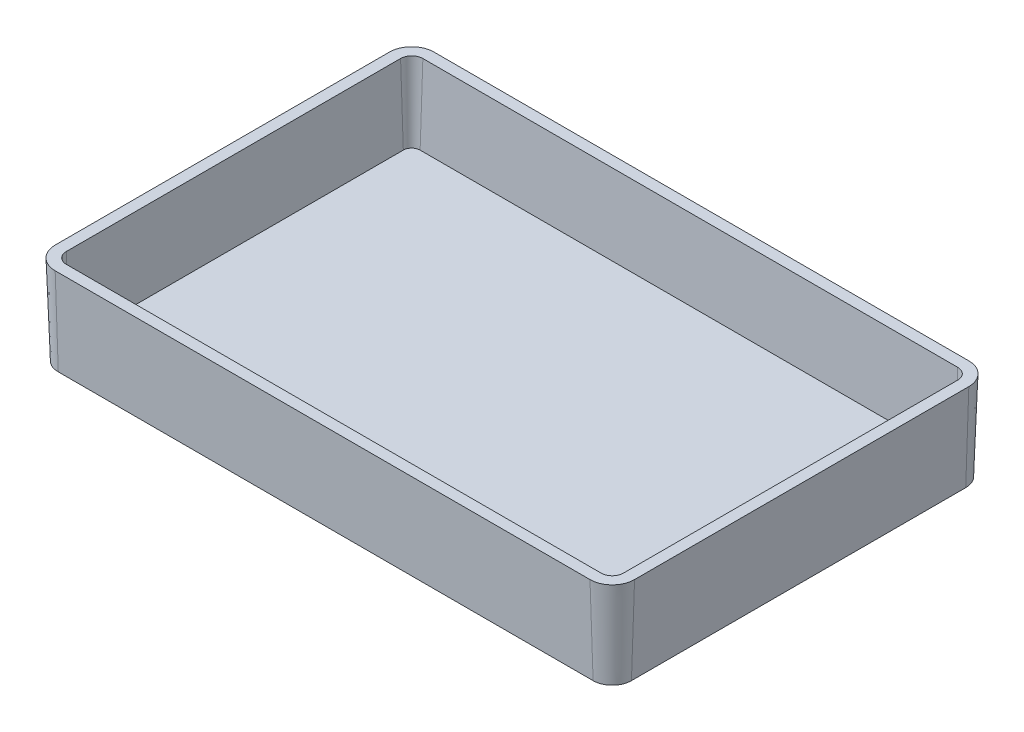
ISO-10303-21;
HEADER;
FILE_DESCRIPTION(('STEP AP214'),'2;1');
FILE_NAME('part.step','',(''),(''),'','','');
FILE_SCHEMA(('AUTOMOTIVE_DESIGN { 1 0 10303 214 1 1 1 1 }'));
ENDSEC;
DATA;
#1=APPLICATION_CONTEXT('core data for automotive mechanical design processes');
#2=APPLICATION_PROTOCOL_DEFINITION('international standard','automotive_design',2000,#1);
#3=PRODUCT_CONTEXT('',#1,'mechanical');
#4=PRODUCT('Part','Part','',(#3));
#5=PRODUCT_RELATED_PRODUCT_CATEGORY('part','',(#4));
#6=PRODUCT_DEFINITION_FORMATION('','',#4);
#7=PRODUCT_DEFINITION_CONTEXT('part definition',#1,'design');
#8=PRODUCT_DEFINITION('design','',#6,#7);
#9=PRODUCT_DEFINITION_SHAPE('','',#8);
#10=(LENGTH_UNIT() NAMED_UNIT(*) SI_UNIT(.MILLI.,.METRE.));
#11=(NAMED_UNIT(*) PLANE_ANGLE_UNIT() SI_UNIT($,.RADIAN.));
#12=(NAMED_UNIT(*) SI_UNIT($,.STERADIAN.) SOLID_ANGLE_UNIT());
#13=UNCERTAINTY_MEASURE_WITH_UNIT(LENGTH_MEASURE(1.E-05),#10,'distance_accuracy_value','');
#14=(GEOMETRIC_REPRESENTATION_CONTEXT(3) GLOBAL_UNCERTAINTY_ASSIGNED_CONTEXT((#13)) GLOBAL_UNIT_ASSIGNED_CONTEXT((#10,
#11,#12)) REPRESENTATION_CONTEXT('',''));
#15=CARTESIAN_POINT('',(0.,0.,0.));
#16=DIRECTION('',(0.,0.,1.));
#17=DIRECTION('',(1.,0.,0.));
#18=AXIS2_PLACEMENT_3D('',#15,#16,#17);
#19=CARTESIAN_POINT('',(-12.,0.,-7.5));
#20=DIRECTION('',(0.,-1.,0.));
#21=DIRECTION('',(0.,0.,-1.));
#22=AXIS2_PLACEMENT_3D('',#19,#20,#21);
#23=PLANE('',#22);
#24=CARTESIAN_POINT('',(-12.,0.,-7.5));
#25=DIRECTION('',(0.,1.,0.));
#26=DIRECTION('',(0.,0.,-1.));
#27=AXIS2_PLACEMENT_3D('',#24,#25,#26);
#28=CIRCLE('',#27,1.);
#29=CARTESIAN_POINT('',(-12.,0.,-8.5));
#30=VERTEX_POINT('',#29);
#31=CARTESIAN_POINT('',(-13.,0.,-7.5));
#32=VERTEX_POINT('',#31);
#33=EDGE_CURVE('E175',#30,#32,#28,.T.);
#34=ORIENTED_EDGE('',*,*,#33,.T.);
#35=DIRECTION('',(0.,0.,1.));
#36=VECTOR('',#35,1.);
#37=CARTESIAN_POINT('',(-13.,0.,7.5));
#38=LINE('',#37,#36);
#39=CARTESIAN_POINT('',(-13.,0.,7.5));
#40=VERTEX_POINT('',#39);
#41=EDGE_CURVE('E240',#32,#40,#38,.T.);
#42=ORIENTED_EDGE('',*,*,#41,.T.);
#43=CARTESIAN_POINT('',(-12.,0.,7.5));
#44=DIRECTION('',(0.,1.,0.));
#45=DIRECTION('',(0.,0.,-1.));
#46=AXIS2_PLACEMENT_3D('',#43,#44,#45);
#47=CIRCLE('',#46,1.);
#48=CARTESIAN_POINT('',(-12.,0.,8.5));
#49=VERTEX_POINT('',#48);
#50=EDGE_CURVE('E243',#40,#49,#47,.T.);
#51=ORIENTED_EDGE('',*,*,#50,.T.);
#52=DIRECTION('',(1.,0.,0.));
#53=VECTOR('',#52,1.);
#54=CARTESIAN_POINT('',(-12.,0.,8.5));
#55=LINE('',#54,#53);
#56=CARTESIAN_POINT('',(12.,0.,8.5));
#57=VERTEX_POINT('',#56);
#58=EDGE_CURVE('E246',#49,#57,#55,.T.);
#59=ORIENTED_EDGE('',*,*,#58,.T.);
#60=CARTESIAN_POINT('',(12.,0.,7.5));
#61=DIRECTION('',(0.,1.,0.));
#62=DIRECTION('',(0.,0.,-1.));
#63=AXIS2_PLACEMENT_3D('',#60,#61,#62);
#64=CIRCLE('',#63,1.);
#65=CARTESIAN_POINT('',(13.,0.,7.5));
#66=VERTEX_POINT('',#65);
#67=EDGE_CURVE('E249',#57,#66,#64,.T.);
#68=ORIENTED_EDGE('',*,*,#67,.T.);
#69=DIRECTION('',(0.,0.,-1.));
#70=VECTOR('',#69,1.);
#71=CARTESIAN_POINT('',(13.,0.,7.5));
#72=LINE('',#71,#70);
#73=CARTESIAN_POINT('',(13.,0.,-7.5));
#74=VERTEX_POINT('',#73);
#75=EDGE_CURVE('E252',#66,#74,#72,.T.);
#76=ORIENTED_EDGE('',*,*,#75,.T.);
#77=CARTESIAN_POINT('',(12.,0.,-7.5));
#78=DIRECTION('',(0.,1.,0.));
#79=DIRECTION('',(0.,0.,1.));
#80=AXIS2_PLACEMENT_3D('',#77,#78,#79);
#81=CIRCLE('',#80,1.);
#82=CARTESIAN_POINT('',(12.,0.,-8.5));
#83=VERTEX_POINT('',#82);
#84=EDGE_CURVE('E255',#74,#83,#81,.T.);
#85=ORIENTED_EDGE('',*,*,#84,.T.);
#86=DIRECTION('',(-1.,0.,0.));
#87=VECTOR('',#86,1.);
#88=CARTESIAN_POINT('',(-12.,0.,-8.5));
#89=LINE('',#88,#87);
#90=EDGE_CURVE('E257',#83,#30,#89,.T.);
#91=ORIENTED_EDGE('',*,*,#90,.T.);
#92=EDGE_LOOP('',(#34,#42,#51,#59,#68,#76,#85,#91));
#93=FACE_BOUND('',#92,.T.);
#94=CARTESIAN_POINT('',(-12.,0.,-7.5));
#95=DIRECTION('',(0.,-1.,0.));
#96=DIRECTION('',(0.,0.,-1.));
#97=AXIS2_PLACEMENT_3D('',#94,#95,#96);
#98=CIRCLE('',#97,0.49969522785059);
#99=CARTESIAN_POINT('',(-12.,0.,-7.99969522785059));
#100=VERTEX_POINT('',#99);
#101=CARTESIAN_POINT('',(-12.4996952278506,0.,-7.5));
#102=VERTEX_POINT('',#101);
#103=EDGE_CURVE('E219',#100,#102,#98,.F.);
#104=ORIENTED_EDGE('',*,*,#103,.F.);
#105=DIRECTION('',(-1.,0.,0.));
#106=VECTOR('',#105,1.);
#107=CARTESIAN_POINT('',(-12.,0.,-7.99969522785059));
#108=LINE('',#107,#106);
#109=CARTESIAN_POINT('',(12.,0.,-7.99969522785059));
#110=VERTEX_POINT('',#109);
#111=EDGE_CURVE('E171',#110,#100,#108,.T.);
#112=ORIENTED_EDGE('',*,*,#111,.F.);
#113=CARTESIAN_POINT('',(12.,0.,-7.5));
#114=DIRECTION('',(0.,-1.,0.));
#115=DIRECTION('',(0.,0.,-1.));
#116=AXIS2_PLACEMENT_3D('',#113,#114,#115);
#117=CIRCLE('',#116,0.49969522785059);
#118=CARTESIAN_POINT('',(12.4996952278506,0.,-7.5));
#119=VERTEX_POINT('',#118);
#120=EDGE_CURVE('E56',#119,#110,#117,.F.);
#121=ORIENTED_EDGE('',*,*,#120,.F.);
#122=DIRECTION('',(0.,0.,-1.));
#123=VECTOR('',#122,1.);
#124=CARTESIAN_POINT('',(12.4996952278506,0.,7.5));
#125=LINE('',#124,#123);
#126=CARTESIAN_POINT('',(12.4996952278506,0.,7.5));
#127=VERTEX_POINT('',#126);
#128=EDGE_CURVE('E233',#127,#119,#125,.T.);
#129=ORIENTED_EDGE('',*,*,#128,.F.);
#130=CARTESIAN_POINT('',(12.,0.,7.5));
#131=DIRECTION('',(0.,-1.,0.));
#132=DIRECTION('',(0.,0.,-1.));
#133=AXIS2_PLACEMENT_3D('',#130,#131,#132);
#134=CIRCLE('',#133,0.49969522785059);
#135=CARTESIAN_POINT('',(12.,0.,7.99969522785059));
#136=VERTEX_POINT('',#135);
#137=EDGE_CURVE('E230',#136,#127,#134,.F.);
#138=ORIENTED_EDGE('',*,*,#137,.F.);
#139=DIRECTION('',(1.,0.,0.));
#140=VECTOR('',#139,1.);
#141=CARTESIAN_POINT('',(-12.,0.,7.99969522785059));
#142=LINE('',#141,#140);
#143=CARTESIAN_POINT('',(-12.,0.,7.99969522785059));
#144=VERTEX_POINT('',#143);
#145=EDGE_CURVE('E227',#144,#136,#142,.T.);
#146=ORIENTED_EDGE('',*,*,#145,.F.);
#147=CARTESIAN_POINT('',(-12.,0.,7.5));
#148=DIRECTION('',(0.,-1.,0.));
#149=DIRECTION('',(0.,0.,-1.));
#150=AXIS2_PLACEMENT_3D('',#147,#148,#149);
#151=CIRCLE('',#150,0.49969522785059);
#152=CARTESIAN_POINT('',(-12.4996952278506,0.,7.5));
#153=VERTEX_POINT('',#152);
#154=EDGE_CURVE('E224',#153,#144,#151,.F.);
#155=ORIENTED_EDGE('',*,*,#154,.F.);
#156=DIRECTION('',(0.,0.,1.));
#157=VECTOR('',#156,1.);
#158=CARTESIAN_POINT('',(-12.4996952278506,0.,7.5));
#159=LINE('',#158,#157);
#160=EDGE_CURVE('E221',#102,#153,#159,.T.);
#161=ORIENTED_EDGE('',*,*,#160,.F.);
#162=EDGE_LOOP('',(#104,#112,#121,#129,#138,#146,#155,#161));
#163=FACE_BOUND('',#162,.T.);
#164=ADVANCED_FACE('F39',(#93,#163),#23,.F.);
#165=CARTESIAN_POINT('',(-12.,0.,-7.5));
#166=DIRECTION('',(0.,1.,0.));
#167=DIRECTION('',(0.,0.,-1.));
#168=AXIS2_PLACEMENT_3D('',#165,#166,#167);
#169=CONICAL_SURFACE('',#168,1.,0.0349065850398867);
#170=ORIENTED_EDGE('',*,*,#33,.F.);
#171=DIRECTION('',(0.,0.999390827019096,-0.034899496702501));
#172=VECTOR('',#171,1.);
#173=CARTESIAN_POINT('',(-12.,0.,-8.5));
#174=LINE('',#173,#172);
#175=CARTESIAN_POINT('',(-12.,-4.,-8.36031692203301));
#176=VERTEX_POINT('',#175);
#177=EDGE_CURVE('E11',#176,#30,#174,.T.);
#178=ORIENTED_EDGE('',*,*,#177,.F.);
#179=CARTESIAN_POINT('',(-12.,-4.,-7.5));
#180=DIRECTION('',(0.,-1.,0.));
#181=DIRECTION('',(0.,0.,-1.));
#182=AXIS2_PLACEMENT_3D('',#179,#180,#181);
#183=CIRCLE('',#182,0.860316922033009);
#184=CARTESIAN_POINT('',(-12.860316922033,-4.,-7.5));
#185=VERTEX_POINT('',#184);
#186=EDGE_CURVE('E259',#176,#185,#183,.F.);
#187=ORIENTED_EDGE('',*,*,#186,.T.);
#188=DIRECTION('',(-0.034899496702501,0.999390827019096,0.));
#189=VECTOR('',#188,1.);
#190=CARTESIAN_POINT('',(-13.,0.,-7.5));
#191=LINE('',#190,#189);
#192=EDGE_CURVE('E91',#185,#32,#191,.T.);
#193=ORIENTED_EDGE('',*,*,#192,.T.);
#194=EDGE_LOOP('',(#170,#178,#187,#193));
#195=FACE_BOUND('',#194,.T.);
#196=ADVANCED_FACE('F296',(#195),#169,.T.);
#197=CARTESIAN_POINT('',(-12.,0.,-8.5));
#198=DIRECTION('',(0.,-0.034899496702501,-0.999390827019096));
#199=DIRECTION('',(0.,0.999390827019096,-0.034899496702501));
#200=AXIS2_PLACEMENT_3D('',#197,#198,#199);
#201=PLANE('',#200);
#202=ORIENTED_EDGE('',*,*,#90,.F.);
#203=DIRECTION('',(0.,0.999390827019096,-0.034899496702501));
#204=VECTOR('',#203,1.);
#205=CARTESIAN_POINT('',(12.,0.,-8.5));
#206=LINE('',#205,#204);
#207=CARTESIAN_POINT('',(12.,-4.,-8.36031692203301));
#208=VERTEX_POINT('',#207);
#209=EDGE_CURVE('E48',#208,#83,#206,.T.);
#210=ORIENTED_EDGE('',*,*,#209,.F.);
#211=DIRECTION('',(-1.,0.,0.));
#212=VECTOR('',#211,1.);
#213=CARTESIAN_POINT('',(-12.,-4.,-8.36031692203301));
#214=LINE('',#213,#212);
#215=EDGE_CURVE('E263',#208,#176,#214,.T.);
#216=ORIENTED_EDGE('',*,*,#215,.T.);
#217=ORIENTED_EDGE('',*,*,#177,.T.);
#218=EDGE_LOOP('',(#202,#210,#216,#217));
#219=FACE_BOUND('',#218,.T.);
#220=ADVANCED_FACE('F41',(#219),#201,.T.);
#221=CARTESIAN_POINT('',(12.,0.,-7.5));
#222=DIRECTION('',(0.,1.,0.));
#223=DIRECTION('',(0.,0.,1.));
#224=AXIS2_PLACEMENT_3D('',#221,#222,#223);
#225=CONICAL_SURFACE('',#224,1.,0.0349065850398867);
#226=ORIENTED_EDGE('',*,*,#84,.F.);
#227=DIRECTION('',(0.034899496702501,0.999390827019096,0.));
#228=VECTOR('',#227,1.);
#229=CARTESIAN_POINT('',(13.,0.,-7.5));
#230=LINE('',#229,#228);
#231=CARTESIAN_POINT('',(12.860316922033,-4.,-7.5));
#232=VERTEX_POINT('',#231);
#233=EDGE_CURVE('E271',#232,#74,#230,.T.);
#234=ORIENTED_EDGE('',*,*,#233,.F.);
#235=CARTESIAN_POINT('',(12.,-4.,-7.5));
#236=DIRECTION('',(0.,-1.,0.));
#237=DIRECTION('',(0.,0.,-1.));
#238=AXIS2_PLACEMENT_3D('',#235,#236,#237);
#239=CIRCLE('',#238,0.860316922033009);
#240=EDGE_CURVE('E276',#232,#208,#239,.F.);
#241=ORIENTED_EDGE('',*,*,#240,.T.);
#242=ORIENTED_EDGE('',*,*,#209,.T.);
#243=EDGE_LOOP('',(#226,#234,#241,#242));
#244=FACE_BOUND('',#243,.T.);
#245=ADVANCED_FACE('F300',(#244),#225,.T.);
#246=CARTESIAN_POINT('',(13.,0.,7.5));
#247=DIRECTION('',(0.999390827019096,-0.034899496702501,0.));
#248=DIRECTION('',(0.0348994967025011,0.999390827019096,0.));
#249=AXIS2_PLACEMENT_3D('',#246,#247,#248);
#250=PLANE('',#249);
#251=ORIENTED_EDGE('',*,*,#75,.F.);
#252=DIRECTION('',(0.034899496702501,0.999390827019096,0.));
#253=VECTOR('',#252,1.);
#254=CARTESIAN_POINT('',(13.,0.,7.5));
#255=LINE('',#254,#253);
#256=CARTESIAN_POINT('',(12.860316922033,-4.,7.5));
#257=VERTEX_POINT('',#256);
#258=EDGE_CURVE('E269',#257,#66,#255,.T.);
#259=ORIENTED_EDGE('',*,*,#258,.F.);
#260=DIRECTION('',(0.,0.,-1.));
#261=VECTOR('',#260,1.);
#262=CARTESIAN_POINT('',(12.860316922033,-4.,7.5));
#263=LINE('',#262,#261);
#264=EDGE_CURVE('E278',#257,#232,#263,.T.);
#265=ORIENTED_EDGE('',*,*,#264,.T.);
#266=ORIENTED_EDGE('',*,*,#233,.T.);
#267=EDGE_LOOP('',(#251,#259,#265,#266));
#268=FACE_BOUND('',#267,.T.);
#269=ADVANCED_FACE('F305',(#268),#250,.T.);
#270=CARTESIAN_POINT('',(12.,0.,7.5));
#271=DIRECTION('',(0.,1.,0.));
#272=DIRECTION('',(0.,0.,-1.));
#273=AXIS2_PLACEMENT_3D('',#270,#271,#272);
#274=CONICAL_SURFACE('',#273,1.,0.0349065850398867);
#275=ORIENTED_EDGE('',*,*,#67,.F.);
#276=DIRECTION('',(0.,0.999390827019096,0.034899496702501));
#277=VECTOR('',#276,1.);
#278=CARTESIAN_POINT('',(12.,0.,8.5));
#279=LINE('',#278,#277);
#280=CARTESIAN_POINT('',(12.,-4.,8.36031692203301));
#281=VERTEX_POINT('',#280);
#282=EDGE_CURVE('E267',#281,#57,#279,.T.);
#283=ORIENTED_EDGE('',*,*,#282,.F.);
#284=CARTESIAN_POINT('',(12.,-4.,7.5));
#285=DIRECTION('',(0.,-1.,0.));
#286=DIRECTION('',(0.,0.,-1.));
#287=AXIS2_PLACEMENT_3D('',#284,#285,#286);
#288=CIRCLE('',#287,0.860316922033009);
#289=EDGE_CURVE('E281',#281,#257,#288,.F.);
#290=ORIENTED_EDGE('',*,*,#289,.T.);
#291=ORIENTED_EDGE('',*,*,#258,.T.);
#292=EDGE_LOOP('',(#275,#283,#290,#291));
#293=FACE_BOUND('',#292,.T.);
#294=ADVANCED_FACE('F308',(#293),#274,.T.);
#295=CARTESIAN_POINT('',(-12.,0.,8.5));
#296=DIRECTION('',(0.,-0.034899496702501,0.999390827019096));
#297=DIRECTION('',(0.,-0.999390827019096,-0.034899496702501));
#298=AXIS2_PLACEMENT_3D('',#295,#296,#297);
#299=PLANE('',#298);
#300=ORIENTED_EDGE('',*,*,#58,.F.);
#301=DIRECTION('',(0.,0.999390827019096,0.034899496702501));
#302=VECTOR('',#301,1.);
#303=CARTESIAN_POINT('',(-12.,0.,8.5));
#304=LINE('',#303,#302);
#305=CARTESIAN_POINT('',(-12.,-4.,8.36031692203301));
#306=VERTEX_POINT('',#305);
#307=EDGE_CURVE('E265',#306,#49,#304,.T.);
#308=ORIENTED_EDGE('',*,*,#307,.F.);
#309=DIRECTION('',(1.,0.,0.));
#310=VECTOR('',#309,1.);
#311=CARTESIAN_POINT('',(-12.,-4.,8.36031692203301));
#312=LINE('',#311,#310);
#313=EDGE_CURVE('E284',#306,#281,#312,.T.);
#314=ORIENTED_EDGE('',*,*,#313,.T.);
#315=ORIENTED_EDGE('',*,*,#282,.T.);
#316=EDGE_LOOP('',(#300,#308,#314,#315));
#317=FACE_BOUND('',#316,.T.);
#318=ADVANCED_FACE('F311',(#317),#299,.T.);
#319=CARTESIAN_POINT('',(-12.,0.,7.5));
#320=DIRECTION('',(0.,1.,0.));
#321=DIRECTION('',(0.,0.,-1.));
#322=AXIS2_PLACEMENT_3D('',#319,#320,#321);
#323=CONICAL_SURFACE('',#322,1.,0.0349065850398867);
#324=ORIENTED_EDGE('',*,*,#50,.F.);
#325=DIRECTION('',(-0.034899496702501,0.999390827019096,0.));
#326=VECTOR('',#325,1.);
#327=CARTESIAN_POINT('',(-13.,0.,7.5));
#328=LINE('',#327,#326);
#329=CARTESIAN_POINT('',(-12.860316922033,-4.,7.5));
#330=VERTEX_POINT('',#329);
#331=EDGE_CURVE('E262',#330,#40,#328,.T.);
#332=ORIENTED_EDGE('',*,*,#331,.F.);
#333=CARTESIAN_POINT('',(-12.,-4.,7.5));
#334=DIRECTION('',(0.,-1.,0.));
#335=DIRECTION('',(0.,0.,-1.));
#336=AXIS2_PLACEMENT_3D('',#333,#334,#335);
#337=CIRCLE('',#336,0.860316922033009);
#338=EDGE_CURVE('E286',#330,#306,#337,.F.);
#339=ORIENTED_EDGE('',*,*,#338,.T.);
#340=ORIENTED_EDGE('',*,*,#307,.T.);
#341=EDGE_LOOP('',(#324,#332,#339,#340));
#342=FACE_BOUND('',#341,.T.);
#343=ADVANCED_FACE('F312',(#342),#323,.T.);
#344=CARTESIAN_POINT('',(-13.,0.,7.5));
#345=DIRECTION('',(-0.999390827019096,-0.034899496702501,0.));
#346=DIRECTION('',(0.0348994967025011,-0.999390827019096,0.));
#347=AXIS2_PLACEMENT_3D('',#344,#345,#346);
#348=PLANE('',#347);
#349=ORIENTED_EDGE('',*,*,#41,.F.);
#350=ORIENTED_EDGE('',*,*,#192,.F.);
#351=DIRECTION('',(0.,0.,1.));
#352=VECTOR('',#351,1.);
#353=CARTESIAN_POINT('',(-12.860316922033,-4.,7.5));
#354=LINE('',#353,#352);
#355=EDGE_CURVE('E43',#185,#330,#354,.T.);
#356=ORIENTED_EDGE('',*,*,#355,.T.);
#357=ORIENTED_EDGE('',*,*,#331,.T.);
#358=EDGE_LOOP('',(#349,#350,#356,#357));
#359=FACE_BOUND('',#358,.T.);
#360=ADVANCED_FACE('F290',(#359),#348,.T.);
#361=CARTESIAN_POINT('',(-12.,-4.,-7.5));
#362=DIRECTION('',(0.,-1.,0.));
#363=DIRECTION('',(0.,0.,-1.));
#364=AXIS2_PLACEMENT_3D('',#361,#362,#363);
#365=PLANE('',#364);
#366=ORIENTED_EDGE('',*,*,#186,.F.);
#367=ORIENTED_EDGE('',*,*,#215,.F.);
#368=ORIENTED_EDGE('',*,*,#240,.F.);
#369=ORIENTED_EDGE('',*,*,#264,.F.);
#370=ORIENTED_EDGE('',*,*,#289,.F.);
#371=ORIENTED_EDGE('',*,*,#313,.F.);
#372=ORIENTED_EDGE('',*,*,#338,.F.);
#373=ORIENTED_EDGE('',*,*,#355,.F.);
#374=EDGE_LOOP('',(#366,#367,#368,#369,#370,#371,#372,#373));
#375=FACE_BOUND('',#374,.T.);
#376=ADVANCED_FACE('F293',(#375),#365,.T.);
#377=CARTESIAN_POINT('',(-12.,0.0174497483512505,-7.5));
#378=DIRECTION('',(0.,1.,0.));
#379=DIRECTION('',(0.,0.,-1.));
#380=AXIS2_PLACEMENT_3D('',#377,#378,#379);
#381=CONICAL_SURFACE('',#380,0.500304586490453,0.0349065850398867);
#382=ORIENTED_EDGE('',*,*,#103,.T.);
#383=DIRECTION('',(-0.034899496702501,0.999390827019096,0.));
#384=VECTOR('',#383,1.);
#385=CARTESIAN_POINT('',(-12.5003045864905,0.0174497483512505,-7.5));
#386=LINE('',#385,#384);
#387=CARTESIAN_POINT('',(-12.3774725346295,-3.5,-7.5));
#388=VERTEX_POINT('',#387);
#389=EDGE_CURVE('E181',#388,#102,#386,.T.);
#390=ORIENTED_EDGE('',*,*,#389,.F.);
#391=CARTESIAN_POINT('',(-12.,-3.5,-7.5));
#392=DIRECTION('',(0.,-1.,0.));
#393=DIRECTION('',(0.,0.,-1.));
#394=AXIS2_PLACEMENT_3D('',#391,#392,#393);
#395=CIRCLE('',#394,0.377472534629472);
#396=CARTESIAN_POINT('',(-12.,-3.5,-7.87747253462947));
#397=VERTEX_POINT('',#396);
#398=EDGE_CURVE('E179',#397,#388,#395,.F.);
#399=ORIENTED_EDGE('',*,*,#398,.F.);
#400=DIRECTION('',(0.,0.999390827019096,-0.034899496702501));
#401=VECTOR('',#400,1.);
#402=CARTESIAN_POINT('',(-12.,0.0174497483512505,-8.00030458649045));
#403=LINE('',#402,#401);
#404=EDGE_CURVE('E165',#397,#100,#403,.T.);
#405=ORIENTED_EDGE('',*,*,#404,.T.);
#406=EDGE_LOOP('',(#382,#390,#399,#405));
#407=FACE_BOUND('',#406,.T.);
#408=ADVANCED_FACE('F180',(#407),#381,.F.);
#409=CARTESIAN_POINT('',(-12.,0.0174497483512505,-8.00030458649045));
#410=DIRECTION('',(0.,-0.034899496702501,-0.999390827019096));
#411=DIRECTION('',(0.,0.999390827019096,-0.034899496702501));
#412=AXIS2_PLACEMENT_3D('',#409,#410,#411);
#413=PLANE('',#412);
#414=ORIENTED_EDGE('',*,*,#111,.T.);
#415=ORIENTED_EDGE('',*,*,#404,.F.);
#416=DIRECTION('',(-1.,0.,0.));
#417=VECTOR('',#416,1.);
#418=CARTESIAN_POINT('',(-12.,-3.5,-7.87747253462947));
#419=LINE('',#418,#417);
#420=CARTESIAN_POINT('',(12.,-3.5,-7.87747253462947));
#421=VERTEX_POINT('',#420);
#422=EDGE_CURVE('E169',#421,#397,#419,.T.);
#423=ORIENTED_EDGE('',*,*,#422,.F.);
#424=DIRECTION('',(0.,0.999390827019096,-0.034899496702501));
#425=VECTOR('',#424,1.);
#426=CARTESIAN_POINT('',(12.,0.0174497483512505,-8.00030458649045));
#427=LINE('',#426,#425);
#428=EDGE_CURVE('E176',#421,#110,#427,.T.);
#429=ORIENTED_EDGE('',*,*,#428,.T.);
#430=EDGE_LOOP('',(#414,#415,#423,#429));
#431=FACE_BOUND('',#430,.T.);
#432=ADVANCED_FACE('F167',(#431),#413,.F.);
#433=CARTESIAN_POINT('',(12.,0.0174497483512505,-7.5));
#434=DIRECTION('',(0.,1.,0.));
#435=DIRECTION('',(0.,0.,1.));
#436=AXIS2_PLACEMENT_3D('',#433,#434,#435);
#437=CONICAL_SURFACE('',#436,0.500304586490453,0.0349065850398867);
#438=ORIENTED_EDGE('',*,*,#120,.T.);
#439=ORIENTED_EDGE('',*,*,#428,.F.);
#440=CARTESIAN_POINT('',(12.,-3.5,-7.5));
#441=DIRECTION('',(0.,-1.,0.));
#442=DIRECTION('',(0.,0.,-1.));
#443=AXIS2_PLACEMENT_3D('',#440,#441,#442);
#444=CIRCLE('',#443,0.377472534629472);
#445=CARTESIAN_POINT('',(12.3774725346295,-3.5,-7.5));
#446=VERTEX_POINT('',#445);
#447=EDGE_CURVE('E191',#446,#421,#444,.F.);
#448=ORIENTED_EDGE('',*,*,#447,.F.);
#449=DIRECTION('',(0.0348994967025011,0.999390827019096,0.));
#450=VECTOR('',#449,1.);
#451=CARTESIAN_POINT('',(12.5003045864905,0.0174497483512505,-7.5));
#452=LINE('',#451,#450);
#453=EDGE_CURVE('E199',#446,#119,#452,.T.);
#454=ORIENTED_EDGE('',*,*,#453,.T.);
#455=EDGE_LOOP('',(#438,#439,#448,#454));
#456=FACE_BOUND('',#455,.T.);
#457=ADVANCED_FACE('F351',(#456),#437,.F.);
#458=CARTESIAN_POINT('',(12.5003045864905,0.0174497483512505,7.5));
#459=DIRECTION('',(0.999390827019096,-0.034899496702501,0.));
#460=DIRECTION('',(0.0348994967025011,0.999390827019096,0.));
#461=AXIS2_PLACEMENT_3D('',#458,#459,#460);
#462=PLANE('',#461);
#463=ORIENTED_EDGE('',*,*,#128,.T.);
#464=ORIENTED_EDGE('',*,*,#453,.F.);
#465=DIRECTION('',(0.,0.,-1.));
#466=VECTOR('',#465,1.);
#467=CARTESIAN_POINT('',(12.3774725346295,-3.5,7.5));
#468=LINE('',#467,#466);
#469=CARTESIAN_POINT('',(12.3774725346295,-3.5,7.5));
#470=VERTEX_POINT('',#469);
#471=EDGE_CURVE('E195',#470,#446,#468,.T.);
#472=ORIENTED_EDGE('',*,*,#471,.F.);
#473=DIRECTION('',(0.034899496702501,0.999390827019096,0.));
#474=VECTOR('',#473,1.);
#475=CARTESIAN_POINT('',(12.5003045864905,0.0174497483512505,7.5));
#476=LINE('',#475,#474);
#477=EDGE_CURVE('E200',#470,#127,#476,.T.);
#478=ORIENTED_EDGE('',*,*,#477,.T.);
#479=EDGE_LOOP('',(#463,#464,#472,#478));
#480=FACE_BOUND('',#479,.T.);
#481=ADVANCED_FACE('F347',(#480),#462,.F.);
#482=CARTESIAN_POINT('',(12.,0.0174497483512505,7.5));
#483=DIRECTION('',(0.,1.,0.));
#484=DIRECTION('',(0.,0.,-1.));
#485=AXIS2_PLACEMENT_3D('',#482,#483,#484);
#486=CONICAL_SURFACE('',#485,0.500304586490453,0.0349065850398867);
#487=ORIENTED_EDGE('',*,*,#137,.T.);
#488=ORIENTED_EDGE('',*,*,#477,.F.);
#489=CARTESIAN_POINT('',(12.,-3.5,7.5));
#490=DIRECTION('',(0.,-1.,0.));
#491=DIRECTION('',(0.,0.,-1.));
#492=AXIS2_PLACEMENT_3D('',#489,#490,#491);
#493=CIRCLE('',#492,0.377472534629472);
#494=CARTESIAN_POINT('',(12.,-3.5,7.87747253462947));
#495=VERTEX_POINT('',#494);
#496=EDGE_CURVE('E205',#495,#470,#493,.F.);
#497=ORIENTED_EDGE('',*,*,#496,.F.);
#498=DIRECTION('',(0.,-0.999390827019096,-0.034899496702501));
#499=VECTOR('',#498,1.);
#500=CARTESIAN_POINT('',(12.,0.0174497483512505,8.00030458649045));
#501=LINE('',#500,#499);
#502=EDGE_CURVE('E203',#495,#136,#501,.F.);
#503=ORIENTED_EDGE('',*,*,#502,.T.);
#504=EDGE_LOOP('',(#487,#488,#497,#503));
#505=FACE_BOUND('',#504,.T.);
#506=ADVANCED_FACE('F343',(#505),#486,.F.);
#507=CARTESIAN_POINT('',(-12.,0.0174497483512505,8.00030458649045));
#508=DIRECTION('',(0.,-0.034899496702501,0.999390827019096));
#509=DIRECTION('',(0.,-0.999390827019096,-0.034899496702501));
#510=AXIS2_PLACEMENT_3D('',#507,#508,#509);
#511=PLANE('',#510);
#512=ORIENTED_EDGE('',*,*,#145,.T.);
#513=ORIENTED_EDGE('',*,*,#502,.F.);
#514=DIRECTION('',(1.,0.,0.));
#515=VECTOR('',#514,1.);
#516=CARTESIAN_POINT('',(-12.,-3.5,7.87747253462947));
#517=LINE('',#516,#515);
#518=CARTESIAN_POINT('',(-12.,-3.5,7.87747253462947));
#519=VERTEX_POINT('',#518);
#520=EDGE_CURVE('E210',#519,#495,#517,.T.);
#521=ORIENTED_EDGE('',*,*,#520,.F.);
#522=DIRECTION('',(0.,0.999390827019096,0.034899496702501));
#523=VECTOR('',#522,1.);
#524=CARTESIAN_POINT('',(-12.,0.0174497483512505,8.00030458649045));
#525=LINE('',#524,#523);
#526=EDGE_CURVE('E207',#519,#144,#525,.T.);
#527=ORIENTED_EDGE('',*,*,#526,.T.);
#528=EDGE_LOOP('',(#512,#513,#521,#527));
#529=FACE_BOUND('',#528,.T.);
#530=ADVANCED_FACE('F339',(#529),#511,.F.);
#531=CARTESIAN_POINT('',(-12.,0.0174497483512505,7.5));
#532=DIRECTION('',(0.,1.,0.));
#533=DIRECTION('',(0.,0.,-1.));
#534=AXIS2_PLACEMENT_3D('',#531,#532,#533);
#535=CONICAL_SURFACE('',#534,0.500304586490453,0.0349065850398867);
#536=ORIENTED_EDGE('',*,*,#154,.T.);
#537=ORIENTED_EDGE('',*,*,#526,.F.);
#538=CARTESIAN_POINT('',(-12.,-3.5,7.5));
#539=DIRECTION('',(0.,-1.,0.));
#540=DIRECTION('',(0.,0.,-1.));
#541=AXIS2_PLACEMENT_3D('',#538,#539,#540);
#542=CIRCLE('',#541,0.377472534629472);
#543=CARTESIAN_POINT('',(-12.3774725346295,-3.5,7.5));
#544=VERTEX_POINT('',#543);
#545=EDGE_CURVE('E214',#544,#519,#542,.F.);
#546=ORIENTED_EDGE('',*,*,#545,.F.);
#547=DIRECTION('',(0.0348994967025011,-0.999390827019096,0.));
#548=VECTOR('',#547,1.);
#549=CARTESIAN_POINT('',(-12.5003045864905,0.0174497483512505,7.5));
#550=LINE('',#549,#548);
#551=EDGE_CURVE('E193',#544,#153,#550,.F.);
#552=ORIENTED_EDGE('',*,*,#551,.T.);
#553=EDGE_LOOP('',(#536,#537,#546,#552));
#554=FACE_BOUND('',#553,.T.);
#555=ADVANCED_FACE('F335',(#554),#535,.F.);
#556=CARTESIAN_POINT('',(-12.5003045864905,0.0174497483512505,7.5));
#557=DIRECTION('',(-0.999390827019096,-0.034899496702501,0.));
#558=DIRECTION('',(0.0348994967025011,-0.999390827019096,0.));
#559=AXIS2_PLACEMENT_3D('',#556,#557,#558);
#560=PLANE('',#559);
#561=ORIENTED_EDGE('',*,*,#160,.T.);
#562=ORIENTED_EDGE('',*,*,#551,.F.);
#563=DIRECTION('',(0.,0.,1.));
#564=VECTOR('',#563,1.);
#565=CARTESIAN_POINT('',(-12.3774725346295,-3.5,7.5));
#566=LINE('',#565,#564);
#567=EDGE_CURVE('E185',#388,#544,#566,.T.);
#568=ORIENTED_EDGE('',*,*,#567,.F.);
#569=ORIENTED_EDGE('',*,*,#389,.T.);
#570=EDGE_LOOP('',(#561,#562,#568,#569));
#571=FACE_BOUND('',#570,.T.);
#572=ADVANCED_FACE('F332',(#571),#560,.F.);
#573=CARTESIAN_POINT('',(-12.,-3.5,-7.5));
#574=DIRECTION('',(0.,-1.,0.));
#575=DIRECTION('',(0.,0.,-1.));
#576=AXIS2_PLACEMENT_3D('',#573,#574,#575);
#577=PLANE('',#576);
#578=ORIENTED_EDGE('',*,*,#398,.T.);
#579=ORIENTED_EDGE('',*,*,#567,.T.);
#580=ORIENTED_EDGE('',*,*,#545,.T.);
#581=ORIENTED_EDGE('',*,*,#520,.T.);
#582=ORIENTED_EDGE('',*,*,#496,.T.);
#583=ORIENTED_EDGE('',*,*,#471,.T.);
#584=ORIENTED_EDGE('',*,*,#447,.T.);
#585=ORIENTED_EDGE('',*,*,#422,.T.);
#586=EDGE_LOOP('',(#578,#579,#580,#581,#582,#583,#584,#585));
#587=FACE_BOUND('',#586,.T.);
#588=ADVANCED_FACE('F188',(#587),#577,.F.);
#589=CLOSED_SHELL('',(#164,#196,#220,#245,#269,#294,#318,#343,#360,#376,#408,#432,#457,#481,
#506,#530,#555,#572,#588));
#590=MANIFOLD_SOLID_BREP('B2',#589);
#591=ADVANCED_BREP_SHAPE_REPRESENTATION('',(#18,#590),#14);
#592=SHAPE_DEFINITION_REPRESENTATION(#9,#591);
ENDSEC;
END-ISO-10303-21;
